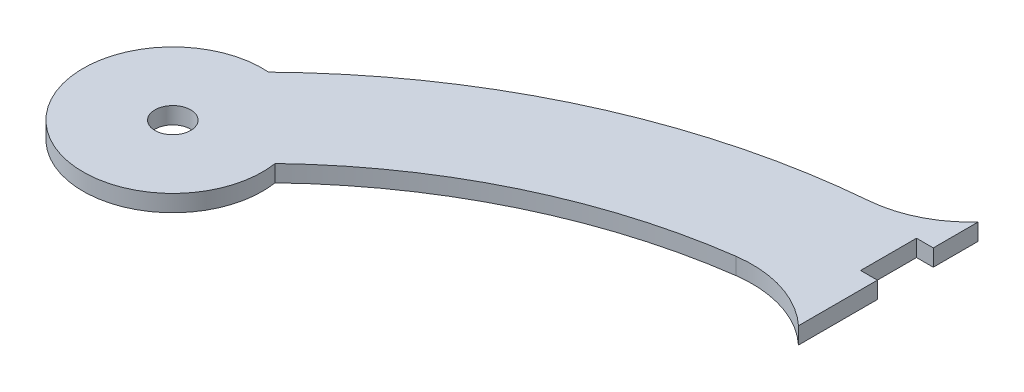
ISO-10303-21;
HEADER;
FILE_DESCRIPTION(('STEP AP214'),'2;1');
FILE_NAME('part.step','',(''),(''),'','','');
FILE_SCHEMA(('AUTOMOTIVE_DESIGN { 1 0 10303 214 1 1 1 1 }'));
ENDSEC;
DATA;
#1=APPLICATION_CONTEXT('core data for automotive mechanical design processes');
#2=APPLICATION_PROTOCOL_DEFINITION('international standard','automotive_design',2000,#1);
#3=PRODUCT_CONTEXT('',#1,'mechanical');
#4=PRODUCT('Part','Part','',(#3));
#5=PRODUCT_RELATED_PRODUCT_CATEGORY('part','',(#4));
#6=PRODUCT_DEFINITION_FORMATION('','',#4);
#7=PRODUCT_DEFINITION_CONTEXT('part definition',#1,'design');
#8=PRODUCT_DEFINITION('design','',#6,#7);
#9=PRODUCT_DEFINITION_SHAPE('','',#8);
#10=(LENGTH_UNIT() NAMED_UNIT(*) SI_UNIT(.MILLI.,.METRE.));
#11=(NAMED_UNIT(*) PLANE_ANGLE_UNIT() SI_UNIT($,.RADIAN.));
#12=(NAMED_UNIT(*) SI_UNIT($,.STERADIAN.) SOLID_ANGLE_UNIT());
#13=UNCERTAINTY_MEASURE_WITH_UNIT(LENGTH_MEASURE(1.E-05),#10,'distance_accuracy_value','');
#14=(GEOMETRIC_REPRESENTATION_CONTEXT(3) GLOBAL_UNCERTAINTY_ASSIGNED_CONTEXT((#13)) GLOBAL_UNIT_ASSIGNED_CONTEXT((#10,
#11,#12)) REPRESENTATION_CONTEXT('',''));
#15=CARTESIAN_POINT('',(0.,0.,0.));
#16=DIRECTION('',(0.,0.,1.));
#17=DIRECTION('',(1.,0.,0.));
#18=AXIS2_PLACEMENT_3D('',#15,#16,#17);
#19=CARTESIAN_POINT('',(87.8142349775282,3.,0.));
#20=DIRECTION('',(-1.,0.,0.));
#21=DIRECTION('',(0.,0.,1.));
#22=AXIS2_PLACEMENT_3D('',#19,#20,#21);
#23=PLANE('',#22);
#24=DIRECTION('',(0.,0.,-1.));
#25=VECTOR('',#24,1.);
#26=CARTESIAN_POINT('',(87.8142349775282,0.,0.));
#27=LINE('',#26,#25);
#28=CARTESIAN_POINT('',(87.8142349775282,0.,-24.1223144771044));
#29=VERTEX_POINT('',#28);
#30=CARTESIAN_POINT('',(87.8142349775282,0.,-38.2323144771044));
#31=VERTEX_POINT('',#30);
#32=EDGE_CURVE('E141',#29,#31,#27,.T.);
#33=ORIENTED_EDGE('',*,*,#32,.T.);
#34=DIRECTION('',(0.,1.,0.));
#35=VECTOR('',#34,1.);
#36=CARTESIAN_POINT('',(87.8142349775282,0.,-38.2323144771044));
#37=LINE('',#36,#35);
#38=CARTESIAN_POINT('',(87.8142349775282,3.,-38.2323144771044));
#39=VERTEX_POINT('',#38);
#40=EDGE_CURVE('E189',#31,#39,#37,.T.);
#41=ORIENTED_EDGE('',*,*,#40,.T.);
#42=DIRECTION('',(0.,0.,-1.));
#43=VECTOR('',#42,1.);
#44=CARTESIAN_POINT('',(87.8142349775282,3.,0.));
#45=LINE('',#44,#43);
#46=CARTESIAN_POINT('',(87.8142349775282,3.,-24.1223144771044));
#47=VERTEX_POINT('',#46);
#48=EDGE_CURVE('E150',#47,#39,#45,.T.);
#49=ORIENTED_EDGE('',*,*,#48,.F.);
#50=DIRECTION('',(0.,-1.,0.));
#51=VECTOR('',#50,1.);
#52=CARTESIAN_POINT('',(87.8142349775282,3.,-24.1223144771044));
#53=LINE('',#52,#51);
#54=EDGE_CURVE('E187',#47,#29,#53,.T.);
#55=ORIENTED_EDGE('',*,*,#54,.T.);
#56=EDGE_LOOP('',(#33,#41,#49,#55));
#57=FACE_BOUND('',#56,.T.);
#58=ADVANCED_FACE('F36',(#57),#23,.F.);
#59=CARTESIAN_POINT('',(85.0277637664127,-0.01,69.7873870329239));
#60=DIRECTION('',(0.,1.,0.));
#61=DIRECTION('',(0.,0.,1.));
#62=AXIS2_PLACEMENT_3D('',#59,#60,#61);
#63=CYLINDRICAL_SURFACE('',#62,100.);
#64=CARTESIAN_POINT('',(85.0277637664127,0.,69.7873870329239));
#65=DIRECTION('',(0.,1.,0.));
#66=DIRECTION('',(0.,0.,1.));
#67=AXIS2_PLACEMENT_3D('',#64,#65,#66);
#68=CIRCLE('',#67,100.);
#69=CARTESIAN_POINT('',(15.8683172988107,0.,-2.4412150876688));
#70=VERTEX_POINT('',#69);
#71=CARTESIAN_POINT('',(71.4869787593617,0.,-29.2916074179324));
#72=VERTEX_POINT('',#71);
#73=EDGE_CURVE('E152',#70,#72,#68,.F.);
#74=ORIENTED_EDGE('',*,*,#73,.T.);
#75=DIRECTION('',(0.,1.,0.));
#76=VECTOR('',#75,1.);
#77=CARTESIAN_POINT('',(71.4869787593617,-0.01,-29.2916074179324));
#78=LINE('',#77,#76);
#79=CARTESIAN_POINT('',(71.4869787593617,3.,-29.2916074179324));
#80=VERTEX_POINT('',#79);
#81=EDGE_CURVE('E177',#72,#80,#78,.T.);
#82=ORIENTED_EDGE('',*,*,#81,.T.);
#83=CARTESIAN_POINT('',(85.0277637664127,3.,69.7873870329239));
#84=DIRECTION('',(0.,1.,0.));
#85=DIRECTION('',(0.,0.,1.));
#86=AXIS2_PLACEMENT_3D('',#83,#84,#85);
#87=CIRCLE('',#86,100.);
#88=CARTESIAN_POINT('',(15.8683172988107,3.,-2.4412150876688));
#89=VERTEX_POINT('',#88);
#90=EDGE_CURVE('E159',#89,#80,#87,.F.);
#91=ORIENTED_EDGE('',*,*,#90,.F.);
#92=DIRECTION('',(0.,1.,0.));
#93=VECTOR('',#92,1.);
#94=CARTESIAN_POINT('',(15.8683172988107,1.495,-2.44121508766881));
#95=LINE('',#94,#93);
#96=EDGE_CURVE('E163',#70,#89,#95,.T.);
#97=ORIENTED_EDGE('',*,*,#96,.F.);
#98=EDGE_LOOP('',(#74,#82,#91,#97));
#99=FACE_BOUND('',#98,.T.);
#100=ADVANCED_FACE('F216',(#99),#63,.F.);
#101=CARTESIAN_POINT('',(85.0277637664127,-0.01,69.7873870329239));
#102=DIRECTION('',(0.,1.,0.));
#103=DIRECTION('',(0.,0.,1.));
#104=AXIS2_PLACEMENT_3D('',#101,#102,#103);
#105=CYLINDRICAL_SURFACE('',#104,120.);
#106=CARTESIAN_POINT('',(85.0277637664127,3.,69.7873870329239));
#107=DIRECTION('',(0.,1.,0.));
#108=DIRECTION('',(0.,0.,1.));
#109=AXIS2_PLACEMENT_3D('',#106,#107,#108);
#110=CIRCLE('',#109,120.);
#111=CARTESIAN_POINT('',(74.7113451100501,3.,-49.7683384933203));
#112=VERTEX_POINT('',#111);
#113=CARTESIAN_POINT('',(1.13509095783689,3.,-16.0148241800351));
#114=VERTEX_POINT('',#113);
#115=EDGE_CURVE('E158',#112,#114,#110,.T.);
#116=ORIENTED_EDGE('',*,*,#115,.F.);
#117=DIRECTION('',(0.,1.,0.));
#118=VECTOR('',#117,1.);
#119=CARTESIAN_POINT('',(74.7113451100501,-0.01,-49.7683384933203));
#120=LINE('',#119,#118);
#121=CARTESIAN_POINT('',(74.7113451100501,0.,-49.7683384933203));
#122=VERTEX_POINT('',#121);
#123=EDGE_CURVE('E171',#112,#122,#120,.F.);
#124=ORIENTED_EDGE('',*,*,#123,.T.);
#125=CARTESIAN_POINT('',(85.0277637664127,0.,69.7873870329239));
#126=DIRECTION('',(0.,1.,0.));
#127=DIRECTION('',(0.,0.,1.));
#128=AXIS2_PLACEMENT_3D('',#125,#126,#127);
#129=CIRCLE('',#128,120.);
#130=CARTESIAN_POINT('',(1.13509095783683,0.,-16.0148241800351));
#131=VERTEX_POINT('',#130);
#132=EDGE_CURVE('E156',#122,#131,#129,.T.);
#133=ORIENTED_EDGE('',*,*,#132,.T.);
#134=DIRECTION('',(0.,1.,0.));
#135=VECTOR('',#134,1.);
#136=CARTESIAN_POINT('',(1.13509095783689,1.495,-16.0148241800351));
#137=LINE('',#136,#135);
#138=EDGE_CURVE('E155',#114,#131,#137,.F.);
#139=ORIENTED_EDGE('',*,*,#138,.F.);
#140=EDGE_LOOP('',(#116,#124,#133,#139));
#141=FACE_BOUND('',#140,.T.);
#142=ADVANCED_FACE('F218',(#141),#105,.T.);
#143=CARTESIAN_POINT('',(87.8142349775282,3.,-48.2323144771044));
#144=VERTEX_POINT('',#143);
#145=CARTESIAN_POINT('',(87.8142349775282,3.,-56.2323144771044));
#146=VERTEX_POINT('',#145);
#147=EDGE_CURVE('E133',#144,#146,#45,.T.);
#148=ORIENTED_EDGE('',*,*,#147,.F.);
#149=DIRECTION('',(0.,1.,0.));
#150=VECTOR('',#149,1.);
#151=CARTESIAN_POINT('',(87.8142349775282,0.,-48.2323144771044));
#152=LINE('',#151,#150);
#153=CARTESIAN_POINT('',(87.8142349775282,0.,-48.2323144771044));
#154=VERTEX_POINT('',#153);
#155=EDGE_CURVE('E51',#154,#144,#152,.T.);
#156=ORIENTED_EDGE('',*,*,#155,.F.);
#157=CARTESIAN_POINT('',(87.8142349775282,0.,-56.2323144771044));
#158=VERTEX_POINT('',#157);
#159=EDGE_CURVE('E131',#154,#158,#27,.T.);
#160=ORIENTED_EDGE('',*,*,#159,.T.);
#161=DIRECTION('',(0.,-1.,0.));
#162=VECTOR('',#161,1.);
#163=CARTESIAN_POINT('',(87.8142349775282,3.,-56.2323144771044));
#164=LINE('',#163,#162);
#165=EDGE_CURVE('E190',#146,#158,#164,.T.);
#166=ORIENTED_EDGE('',*,*,#165,.F.);
#167=EDGE_LOOP('',(#148,#156,#160,#166));
#168=FACE_BOUND('',#167,.T.);
#169=ADVANCED_FACE('F129',(#168),#23,.F.);
#170=CARTESIAN_POINT('',(0.,0.,0.));
#171=DIRECTION('',(0.,1.,0.));
#172=DIRECTION('',(0.,0.,1.));
#173=AXIS2_PLACEMENT_3D('',#170,#171,#172);
#174=PLANE('',#173);
#175=DIRECTION('',(0.,0.,1.));
#176=VECTOR('',#175,1.);
#177=CARTESIAN_POINT('',(84.8142349775282,0.,-48.2323144771044));
#178=LINE('',#177,#176);
#179=CARTESIAN_POINT('',(84.8142349775282,0.,-48.2323144771044));
#180=VERTEX_POINT('',#179);
#181=CARTESIAN_POINT('',(84.8142349775282,0.,-38.2323144771044));
#182=VERTEX_POINT('',#181);
#183=EDGE_CURVE('E124',#180,#182,#178,.T.);
#184=ORIENTED_EDGE('',*,*,#183,.T.);
#185=DIRECTION('',(1.,0.,0.));
#186=VECTOR('',#185,1.);
#187=CARTESIAN_POINT('',(87.8142349775282,0.,-38.2323144771044));
#188=LINE('',#187,#186);
#189=EDGE_CURVE('E134',#182,#31,#188,.T.);
#190=ORIENTED_EDGE('',*,*,#189,.T.);
#191=ORIENTED_EDGE('',*,*,#32,.F.);
#192=CARTESIAN_POINT('',(74.1951357607719,0.,-9.47580852776117));
#193=DIRECTION('',(0.,1.,0.));
#194=DIRECTION('',(0.,0.,1.));
#195=AXIS2_PLACEMENT_3D('',#192,#193,#194);
#196=CIRCLE('',#195,20.);
#197=EDGE_CURVE('E11',#29,#72,#196,.T.);
#198=ORIENTED_EDGE('',*,*,#197,.T.);
#199=ORIENTED_EDGE('',*,*,#73,.F.);
#200=CARTESIAN_POINT('',(-1.2490009027033E-13,0.,0.));
#201=DIRECTION('',(0.,1.,0.));
#202=DIRECTION('',(0.,0.,1.));
#203=AXIS2_PLACEMENT_3D('',#200,#201,#202);
#204=CIRCLE('',#203,16.055);
#205=EDGE_CURVE('E146',#131,#70,#204,.T.);
#206=ORIENTED_EDGE('',*,*,#205,.F.);
#207=ORIENTED_EDGE('',*,*,#132,.F.);
#208=CARTESIAN_POINT('',(72.9919420006563,0.,-69.6942927476944));
#209=DIRECTION('',(0.,1.,0.));
#210=DIRECTION('',(0.,0.,1.));
#211=AXIS2_PLACEMENT_3D('',#208,#209,#210);
#212=CIRCLE('',#211,20.);
#213=CARTESIAN_POINT('',(87.1340776243874,0.,-55.5521571239636));
#214=VERTEX_POINT('',#213);
#215=EDGE_CURVE('E175',#122,#214,#212,.T.);
#216=ORIENTED_EDGE('',*,*,#215,.T.);
#217=DIRECTION('',(-0.707106781186541,0.,0.707106781186554));
#218=VECTOR('',#217,1.);
#219=CARTESIAN_POINT('',(15.7909602502127,0.,15.7909602502124));
#220=LINE('',#219,#218);
#221=EDGE_CURVE('E139',#158,#214,#220,.T.);
#222=ORIENTED_EDGE('',*,*,#221,.F.);
#223=ORIENTED_EDGE('',*,*,#159,.F.);
#224=DIRECTION('',(-1.,0.,0.));
#225=VECTOR('',#224,1.);
#226=CARTESIAN_POINT('',(87.8142349775282,0.,-48.2323144771044));
#227=LINE('',#226,#225);
#228=EDGE_CURVE('E117',#154,#180,#227,.T.);
#229=ORIENTED_EDGE('',*,*,#228,.T.);
#230=EDGE_LOOP('',(#184,#190,#191,#198,#199,#206,#207,#216,#222,#223,#229));
#231=FACE_BOUND('',#230,.T.);
#232=CARTESIAN_POINT('',(0.,0.,0.));
#233=DIRECTION('',(0.,1.,0.));
#234=DIRECTION('',(0.,0.,1.));
#235=AXIS2_PLACEMENT_3D('',#232,#233,#234);
#236=CIRCLE('',#235,3.2);
#237=CARTESIAN_POINT('',(0.,0.,3.19999999999992));
#238=VERTEX_POINT('',#237);
#239=EDGE_CURVE('E202',#238,#238,#236,.T.);
#240=ORIENTED_EDGE('',*,*,#239,.T.);
#241=EDGE_LOOP('',(#240));
#242=FACE_BOUND('',#241,.T.);
#243=ADVANCED_FACE('F136',(#231,#242),#174,.F.);
#244=CARTESIAN_POINT('',(0.,3.,0.));
#245=DIRECTION('',(0.,1.,0.));
#246=DIRECTION('',(0.,0.,1.));
#247=AXIS2_PLACEMENT_3D('',#244,#245,#246);
#248=PLANE('',#247);
#249=DIRECTION('',(1.,0.,0.));
#250=VECTOR('',#249,1.);
#251=CARTESIAN_POINT('',(87.8142349775282,3.,-38.2323144771044));
#252=LINE('',#251,#250);
#253=CARTESIAN_POINT('',(84.8142349775282,3.,-38.2323144771044));
#254=VERTEX_POINT('',#253);
#255=EDGE_CURVE('E125',#254,#39,#252,.T.);
#256=ORIENTED_EDGE('',*,*,#255,.F.);
#257=DIRECTION('',(0.,0.,1.));
#258=VECTOR('',#257,1.);
#259=CARTESIAN_POINT('',(84.8142349775282,3.,-48.2323144771044));
#260=LINE('',#259,#258);
#261=CARTESIAN_POINT('',(84.8142349775282,3.,-48.2323144771044));
#262=VERTEX_POINT('',#261);
#263=EDGE_CURVE('E247',#262,#254,#260,.T.);
#264=ORIENTED_EDGE('',*,*,#263,.F.);
#265=DIRECTION('',(-1.,0.,0.));
#266=VECTOR('',#265,1.);
#267=CARTESIAN_POINT('',(87.8142349775282,3.,-48.2323144771044));
#268=LINE('',#267,#266);
#269=EDGE_CURVE('E245',#144,#262,#268,.T.);
#270=ORIENTED_EDGE('',*,*,#269,.F.);
#271=ORIENTED_EDGE('',*,*,#147,.T.);
#272=DIRECTION('',(-0.707106781186541,0.,0.707106781186554));
#273=VECTOR('',#272,1.);
#274=CARTESIAN_POINT('',(15.7909602502127,3.,15.7909602502124));
#275=LINE('',#274,#273);
#276=CARTESIAN_POINT('',(87.1340776243874,3.,-55.5521571239636));
#277=VERTEX_POINT('',#276);
#278=EDGE_CURVE('E198',#146,#277,#275,.T.);
#279=ORIENTED_EDGE('',*,*,#278,.T.);
#280=CARTESIAN_POINT('',(72.9919420006563,3.,-69.6942927476944));
#281=DIRECTION('',(0.,1.,0.));
#282=DIRECTION('',(0.,0.,1.));
#283=AXIS2_PLACEMENT_3D('',#280,#281,#282);
#284=CIRCLE('',#283,20.);
#285=EDGE_CURVE('E173',#277,#112,#284,.F.);
#286=ORIENTED_EDGE('',*,*,#285,.T.);
#287=ORIENTED_EDGE('',*,*,#115,.T.);
#288=CARTESIAN_POINT('',(-1.2490009027033E-13,3.,0.));
#289=DIRECTION('',(0.,1.,0.));
#290=DIRECTION('',(0.,0.,1.));
#291=AXIS2_PLACEMENT_3D('',#288,#289,#290);
#292=CIRCLE('',#291,16.055);
#293=EDGE_CURVE('E142',#114,#89,#292,.T.);
#294=ORIENTED_EDGE('',*,*,#293,.T.);
#295=ORIENTED_EDGE('',*,*,#90,.T.);
#296=CARTESIAN_POINT('',(74.1951357607719,3.,-9.47580852776117));
#297=DIRECTION('',(0.,1.,0.));
#298=DIRECTION('',(0.,0.,1.));
#299=AXIS2_PLACEMENT_3D('',#296,#297,#298);
#300=CIRCLE('',#299,20.);
#301=EDGE_CURVE('E44',#80,#47,#300,.F.);
#302=ORIENTED_EDGE('',*,*,#301,.T.);
#303=ORIENTED_EDGE('',*,*,#48,.T.);
#304=EDGE_LOOP('',(#256,#264,#270,#271,#279,#286,#287,#294,#295,#302,#303));
#305=FACE_BOUND('',#304,.T.);
#306=CARTESIAN_POINT('',(0.,3.,0.));
#307=DIRECTION('',(0.,1.,0.));
#308=DIRECTION('',(0.,0.,1.));
#309=AXIS2_PLACEMENT_3D('',#306,#307,#308);
#310=CIRCLE('',#309,3.2);
#311=CARTESIAN_POINT('',(0.,3.,3.19999999999992));
#312=VERTEX_POINT('',#311);
#313=EDGE_CURVE('E201',#312,#312,#310,.T.);
#314=ORIENTED_EDGE('',*,*,#313,.F.);
#315=EDGE_LOOP('',(#314));
#316=FACE_BOUND('',#315,.T.);
#317=ADVANCED_FACE('F182',(#305,#316),#248,.T.);
#318=CARTESIAN_POINT('',(-1.2490009027033E-13,-0.01,0.));
#319=DIRECTION('',(0.,1.,0.));
#320=DIRECTION('',(0.,0.,1.));
#321=AXIS2_PLACEMENT_3D('',#318,#319,#320);
#322=CYLINDRICAL_SURFACE('',#321,16.055);
#323=ORIENTED_EDGE('',*,*,#205,.T.);
#324=ORIENTED_EDGE('',*,*,#96,.T.);
#325=ORIENTED_EDGE('',*,*,#293,.F.);
#326=ORIENTED_EDGE('',*,*,#138,.T.);
#327=EDGE_LOOP('',(#323,#324,#325,#326));
#328=FACE_BOUND('',#327,.T.);
#329=ADVANCED_FACE('F209',(#328),#322,.T.);
#330=CARTESIAN_POINT('',(0.,3.,0.));
#331=DIRECTION('',(0.,-1.,0.));
#332=DIRECTION('',(0.,0.,-1.));
#333=AXIS2_PLACEMENT_3D('',#330,#331,#332);
#334=CYLINDRICAL_SURFACE('',#333,3.2);
#335=ORIENTED_EDGE('',*,*,#313,.T.);
#336=EDGE_LOOP('',(#335));
#337=FACE_BOUND('',#336,.T.);
#338=ORIENTED_EDGE('',*,*,#239,.F.);
#339=EDGE_LOOP('',(#338));
#340=FACE_BOUND('',#339,.T.);
#341=ADVANCED_FACE('F237',(#337,#340),#334,.F.);
#342=CARTESIAN_POINT('',(87.8142349775282,-0.01,-56.2323144771044));
#343=DIRECTION('',(-0.707106781186554,0.,-0.707106781186541));
#344=DIRECTION('',(-0.707106781186541,0.,0.707106781186554));
#345=AXIS2_PLACEMENT_3D('',#342,#343,#344);
#346=PLANE('',#345);
#347=ORIENTED_EDGE('',*,*,#221,.T.);
#348=DIRECTION('',(0.,-1.,0.));
#349=VECTOR('',#348,1.);
#350=CARTESIAN_POINT('',(87.1340776243874,3.,-55.5521571239636));
#351=LINE('',#350,#349);
#352=EDGE_CURVE('E166',#214,#277,#351,.F.);
#353=ORIENTED_EDGE('',*,*,#352,.T.);
#354=ORIENTED_EDGE('',*,*,#278,.F.);
#355=ORIENTED_EDGE('',*,*,#165,.T.);
#356=EDGE_LOOP('',(#347,#353,#354,#355));
#357=FACE_BOUND('',#356,.T.);
#358=ADVANCED_FACE('F230',(#357),#346,.T.);
#359=CARTESIAN_POINT('',(72.9919420006563,-0.01,-69.6942927476944));
#360=DIRECTION('',(0.,1.,0.));
#361=DIRECTION('',(0.,0.,1.));
#362=AXIS2_PLACEMENT_3D('',#359,#360,#361);
#363=CYLINDRICAL_SURFACE('',#362,20.);
#364=ORIENTED_EDGE('',*,*,#215,.F.);
#365=ORIENTED_EDGE('',*,*,#123,.F.);
#366=ORIENTED_EDGE('',*,*,#285,.F.);
#367=ORIENTED_EDGE('',*,*,#352,.F.);
#368=EDGE_LOOP('',(#364,#365,#366,#367));
#369=FACE_BOUND('',#368,.T.);
#370=ADVANCED_FACE('F228',(#369),#363,.F.);
#371=CARTESIAN_POINT('',(74.1951357607719,-0.01,-9.47580852776117));
#372=DIRECTION('',(0.,1.,0.));
#373=DIRECTION('',(0.,0.,1.));
#374=AXIS2_PLACEMENT_3D('',#371,#372,#373);
#375=CYLINDRICAL_SURFACE('',#374,20.);
#376=ORIENTED_EDGE('',*,*,#197,.F.);
#377=ORIENTED_EDGE('',*,*,#54,.F.);
#378=ORIENTED_EDGE('',*,*,#301,.F.);
#379=ORIENTED_EDGE('',*,*,#81,.F.);
#380=EDGE_LOOP('',(#376,#377,#378,#379));
#381=FACE_BOUND('',#380,.T.);
#382=ADVANCED_FACE('F38',(#381),#375,.F.);
#383=CARTESIAN_POINT('',(87.8142349775282,0.,-38.2323144771044));
#384=DIRECTION('',(0.,0.,1.));
#385=DIRECTION('',(1.,0.,0.));
#386=AXIS2_PLACEMENT_3D('',#383,#384,#385);
#387=PLANE('',#386);
#388=ORIENTED_EDGE('',*,*,#255,.T.);
#389=ORIENTED_EDGE('',*,*,#40,.F.);
#390=ORIENTED_EDGE('',*,*,#189,.F.);
#391=DIRECTION('',(0.,1.,0.));
#392=VECTOR('',#391,1.);
#393=CARTESIAN_POINT('',(84.8142349775282,0.,-38.2323144771044));
#394=LINE('',#393,#392);
#395=EDGE_CURVE('E193',#182,#254,#394,.T.);
#396=ORIENTED_EDGE('',*,*,#395,.T.);
#397=EDGE_LOOP('',(#388,#389,#390,#396));
#398=FACE_BOUND('',#397,.T.);
#399=ADVANCED_FACE('F236',(#398),#387,.F.);
#400=CARTESIAN_POINT('',(84.8142349775282,0.,-48.2323144771044));
#401=DIRECTION('',(-1.,0.,0.));
#402=DIRECTION('',(0.,0.,1.));
#403=AXIS2_PLACEMENT_3D('',#400,#401,#402);
#404=PLANE('',#403);
#405=ORIENTED_EDGE('',*,*,#263,.T.);
#406=ORIENTED_EDGE('',*,*,#395,.F.);
#407=ORIENTED_EDGE('',*,*,#183,.F.);
#408=DIRECTION('',(0.,1.,0.));
#409=VECTOR('',#408,1.);
#410=CARTESIAN_POINT('',(84.8142349775282,0.,-48.2323144771044));
#411=LINE('',#410,#409);
#412=EDGE_CURVE('E119',#180,#262,#411,.T.);
#413=ORIENTED_EDGE('',*,*,#412,.T.);
#414=EDGE_LOOP('',(#405,#406,#407,#413));
#415=FACE_BOUND('',#414,.T.);
#416=ADVANCED_FACE('F255',(#415),#404,.F.);
#417=CARTESIAN_POINT('',(87.8142349775282,0.,-48.2323144771044));
#418=DIRECTION('',(0.,0.,-1.));
#419=DIRECTION('',(-1.,0.,0.));
#420=AXIS2_PLACEMENT_3D('',#417,#418,#419);
#421=PLANE('',#420);
#422=ORIENTED_EDGE('',*,*,#269,.T.);
#423=ORIENTED_EDGE('',*,*,#412,.F.);
#424=ORIENTED_EDGE('',*,*,#228,.F.);
#425=ORIENTED_EDGE('',*,*,#155,.T.);
#426=EDGE_LOOP('',(#422,#423,#424,#425));
#427=FACE_BOUND('',#426,.T.);
#428=ADVANCED_FACE('F118',(#427),#421,.F.);
#429=CLOSED_SHELL('',(#58,#100,#142,#169,#243,#317,#329,#341,#358,#370,#382,#399,#416,#428));
#430=MANIFOLD_SOLID_BREP('B2',#429);
#431=ADVANCED_BREP_SHAPE_REPRESENTATION('',(#18,#430),#14);
#432=SHAPE_DEFINITION_REPRESENTATION(#9,#431);
ENDSEC;
END-ISO-10303-21;
